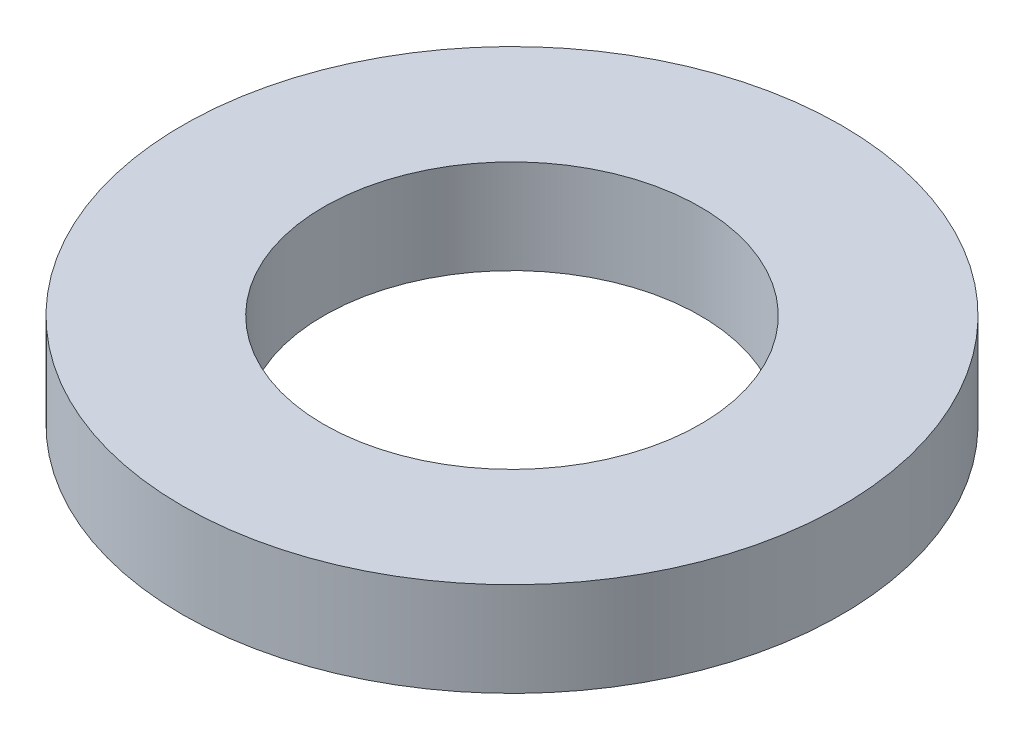
ISO-10303-21;
HEADER;
FILE_DESCRIPTION(('STEP AP214'),'2;1');
FILE_NAME('part.step','',(''),(''),'','','');
FILE_SCHEMA(('AUTOMOTIVE_DESIGN { 1 0 10303 214 1 1 1 1 }'));
ENDSEC;
DATA;
#1=APPLICATION_CONTEXT('core data for automotive mechanical design processes');
#2=APPLICATION_PROTOCOL_DEFINITION('international standard','automotive_design',2000,#1);
#3=PRODUCT_CONTEXT('',#1,'mechanical');
#4=PRODUCT('Part','Part','',(#3));
#5=PRODUCT_RELATED_PRODUCT_CATEGORY('part','',(#4));
#6=PRODUCT_DEFINITION_FORMATION('','',#4);
#7=PRODUCT_DEFINITION_CONTEXT('part definition',#1,'design');
#8=PRODUCT_DEFINITION('design','',#6,#7);
#9=PRODUCT_DEFINITION_SHAPE('','',#8);
#10=(LENGTH_UNIT() NAMED_UNIT(*) SI_UNIT(.MILLI.,.METRE.));
#11=(NAMED_UNIT(*) PLANE_ANGLE_UNIT() SI_UNIT($,.RADIAN.));
#12=(NAMED_UNIT(*) SI_UNIT($,.STERADIAN.) SOLID_ANGLE_UNIT());
#13=UNCERTAINTY_MEASURE_WITH_UNIT(LENGTH_MEASURE(1.E-05),#10,'distance_accuracy_value','');
#14=(GEOMETRIC_REPRESENTATION_CONTEXT(3) GLOBAL_UNCERTAINTY_ASSIGNED_CONTEXT((#13)) GLOBAL_UNIT_ASSIGNED_CONTEXT((#10,
#11,#12)) REPRESENTATION_CONTEXT('',''));
#15=CARTESIAN_POINT('',(0.,0.,0.));
#16=DIRECTION('',(0.,0.,1.));
#17=DIRECTION('',(1.,0.,0.));
#18=AXIS2_PLACEMENT_3D('',#15,#16,#17);
#19=CARTESIAN_POINT('',(0.,1.,0.));
#20=DIRECTION('',(0.,1.,0.));
#21=DIRECTION('',(0.,0.,1.));
#22=AXIS2_PLACEMENT_3D('',#19,#20,#21);
#23=PLANE('',#22);
#24=CARTESIAN_POINT('',(0.,1.,0.));
#25=DIRECTION('',(0.,1.,0.));
#26=DIRECTION('',(0.,0.,1.));
#27=AXIS2_PLACEMENT_3D('',#24,#25,#26);
#28=CIRCLE('',#27,3.5);
#29=CARTESIAN_POINT('',(0.,1.,3.5));
#30=VERTEX_POINT('',#29);
#31=EDGE_CURVE('E10',#30,#30,#28,.T.);
#32=ORIENTED_EDGE('',*,*,#31,.T.);
#33=EDGE_LOOP('',(#32));
#34=FACE_BOUND('',#33,.T.);
#35=CARTESIAN_POINT('',(0.,1.,0.));
#36=DIRECTION('',(0.,1.,0.));
#37=DIRECTION('',(0.,0.,1.));
#38=AXIS2_PLACEMENT_3D('',#35,#36,#37);
#39=CIRCLE('',#38,2.);
#40=CARTESIAN_POINT('',(0.,1.,2.));
#41=VERTEX_POINT('',#40);
#42=EDGE_CURVE('E52',#41,#41,#39,.T.);
#43=ORIENTED_EDGE('',*,*,#42,.F.);
#44=EDGE_LOOP('',(#43));
#45=FACE_BOUND('',#44,.T.);
#46=ADVANCED_FACE('F41',(#34,#45),#23,.T.);
#47=CARTESIAN_POINT('',(0.,0.,0.));
#48=DIRECTION('',(0.,1.,0.));
#49=DIRECTION('',(0.,0.,1.));
#50=AXIS2_PLACEMENT_3D('',#47,#48,#49);
#51=PLANE('',#50);
#52=CARTESIAN_POINT('',(0.,0.,0.));
#53=DIRECTION('',(0.,1.,0.));
#54=DIRECTION('',(0.,0.,1.));
#55=AXIS2_PLACEMENT_3D('',#52,#53,#54);
#56=CIRCLE('',#55,3.5);
#57=CARTESIAN_POINT('',(0.,0.,3.5));
#58=VERTEX_POINT('',#57);
#59=EDGE_CURVE('E45',#58,#58,#56,.T.);
#60=ORIENTED_EDGE('',*,*,#59,.F.);
#61=EDGE_LOOP('',(#60));
#62=FACE_BOUND('',#61,.T.);
#63=CARTESIAN_POINT('',(0.,0.,0.));
#64=DIRECTION('',(0.,1.,0.));
#65=DIRECTION('',(0.,0.,1.));
#66=AXIS2_PLACEMENT_3D('',#63,#64,#65);
#67=CIRCLE('',#66,2.);
#68=CARTESIAN_POINT('',(0.,0.,2.));
#69=VERTEX_POINT('',#68);
#70=EDGE_CURVE('E54',#69,#69,#67,.T.);
#71=ORIENTED_EDGE('',*,*,#70,.T.);
#72=EDGE_LOOP('',(#71));
#73=FACE_BOUND('',#72,.T.);
#74=ADVANCED_FACE('F64',(#62,#73),#51,.F.);
#75=CARTESIAN_POINT('',(0.,1.,0.));
#76=DIRECTION('',(0.,-1.,0.));
#77=DIRECTION('',(0.,0.,-1.));
#78=AXIS2_PLACEMENT_3D('',#75,#76,#77);
#79=CYLINDRICAL_SURFACE('',#78,3.5);
#80=ORIENTED_EDGE('',*,*,#31,.F.);
#81=EDGE_LOOP('',(#80));
#82=FACE_BOUND('',#81,.T.);
#83=ORIENTED_EDGE('',*,*,#59,.T.);
#84=EDGE_LOOP('',(#83));
#85=FACE_BOUND('',#84,.T.);
#86=ADVANCED_FACE('F43',(#82,#85),#79,.T.);
#87=CARTESIAN_POINT('',(0.,1.,0.));
#88=DIRECTION('',(0.,-1.,0.));
#89=DIRECTION('',(0.,0.,-1.));
#90=AXIS2_PLACEMENT_3D('',#87,#88,#89);
#91=CYLINDRICAL_SURFACE('',#90,2.);
#92=ORIENTED_EDGE('',*,*,#42,.T.);
#93=EDGE_LOOP('',(#92));
#94=FACE_BOUND('',#93,.T.);
#95=ORIENTED_EDGE('',*,*,#70,.F.);
#96=EDGE_LOOP('',(#95));
#97=FACE_BOUND('',#96,.T.);
#98=ADVANCED_FACE('F60',(#94,#97),#91,.F.);
#99=CLOSED_SHELL('',(#46,#74,#86,#98));
#100=MANIFOLD_SOLID_BREP('B2',#99);
#101=ADVANCED_BREP_SHAPE_REPRESENTATION('',(#18,#100),#14);
#102=SHAPE_DEFINITION_REPRESENTATION(#9,#101);
ENDSEC;
END-ISO-10303-21;
